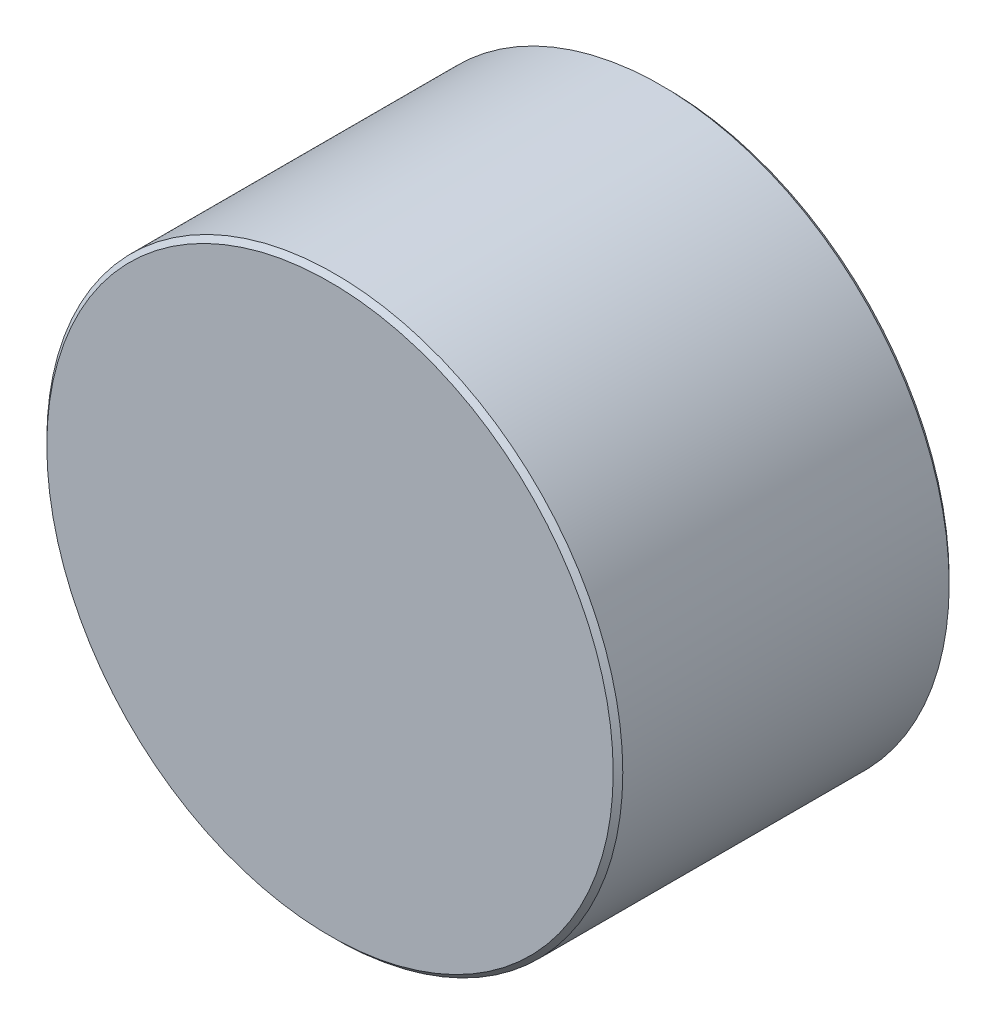
ISO-10303-21;
HEADER;
FILE_DESCRIPTION(('STEP AP214'),'2;1');
FILE_NAME('part.step','',(''),(''),'','','');
FILE_SCHEMA(('AUTOMOTIVE_DESIGN { 1 0 10303 214 1 1 1 1 }'));
ENDSEC;
DATA;
#1=APPLICATION_CONTEXT('core data for automotive mechanical design processes');
#2=APPLICATION_PROTOCOL_DEFINITION('international standard','automotive_design',2000,#1);
#3=PRODUCT_CONTEXT('',#1,'mechanical');
#4=PRODUCT('Part','Part','',(#3));
#5=PRODUCT_RELATED_PRODUCT_CATEGORY('part','',(#4));
#6=PRODUCT_DEFINITION_FORMATION('','',#4);
#7=PRODUCT_DEFINITION_CONTEXT('part definition',#1,'design');
#8=PRODUCT_DEFINITION('design','',#6,#7);
#9=PRODUCT_DEFINITION_SHAPE('','',#8);
#10=(LENGTH_UNIT() NAMED_UNIT(*) SI_UNIT(.MILLI.,.METRE.));
#11=(NAMED_UNIT(*) PLANE_ANGLE_UNIT() SI_UNIT($,.RADIAN.));
#12=(NAMED_UNIT(*) SI_UNIT($,.STERADIAN.) SOLID_ANGLE_UNIT());
#13=UNCERTAINTY_MEASURE_WITH_UNIT(LENGTH_MEASURE(1.E-05),#10,'distance_accuracy_value','');
#14=(GEOMETRIC_REPRESENTATION_CONTEXT(3) GLOBAL_UNCERTAINTY_ASSIGNED_CONTEXT((#13)) GLOBAL_UNIT_ASSIGNED_CONTEXT((#10,
#11,#12)) REPRESENTATION_CONTEXT('',''));
#15=CARTESIAN_POINT('',(0.,0.,0.));
#16=DIRECTION('',(0.,0.,1.));
#17=DIRECTION('',(1.,0.,0.));
#18=AXIS2_PLACEMENT_3D('',#15,#16,#17);
#19=CARTESIAN_POINT('',(0.,0.,7.));
#20=DIRECTION('',(0.,0.,-1.));
#21=DIRECTION('',(-1.,0.,0.));
#22=AXIS2_PLACEMENT_3D('',#19,#20,#21);
#23=CYLINDRICAL_SURFACE('',#22,5.99999999999995);
#24=CARTESIAN_POINT('',(0.,0.,0.0999999999999994));
#25=DIRECTION('',(0.,0.,1.));
#26=DIRECTION('',(1.,0.,0.));
#27=AXIS2_PLACEMENT_3D('',#24,#25,#26);
#28=CIRCLE('',#27,5.99999999999995);
#29=CARTESIAN_POINT('',(5.99999999999995,0.,0.0999999999999994));
#30=VERTEX_POINT('',#29);
#31=EDGE_CURVE('E53',#30,#30,#28,.T.);
#32=ORIENTED_EDGE('',*,*,#31,.T.);
#33=EDGE_LOOP('',(#32));
#34=FACE_BOUND('',#33,.T.);
#35=CARTESIAN_POINT('',(0.,0.,6.9));
#36=DIRECTION('',(0.,0.,1.));
#37=DIRECTION('',(1.,0.,0.));
#38=AXIS2_PLACEMENT_3D('',#35,#36,#37);
#39=CIRCLE('',#38,5.99999999999995);
#40=CARTESIAN_POINT('',(5.99999999999995,0.,6.9));
#41=VERTEX_POINT('',#40);
#42=EDGE_CURVE('E57',#41,#41,#39,.F.);
#43=ORIENTED_EDGE('',*,*,#42,.T.);
#44=EDGE_LOOP('',(#43));
#45=FACE_BOUND('',#44,.T.);
#46=ADVANCED_FACE('F41',(#34,#45),#23,.T.);
#47=CARTESIAN_POINT('',(0.,0.,7.));
#48=DIRECTION('',(0.,0.,1.));
#49=DIRECTION('',(1.,0.,0.));
#50=AXIS2_PLACEMENT_3D('',#47,#48,#49);
#51=PLANE('',#50);
#52=CARTESIAN_POINT('',(0.,0.,7.));
#53=DIRECTION('',(0.,0.,1.));
#54=DIRECTION('',(1.,0.,0.));
#55=AXIS2_PLACEMENT_3D('',#52,#53,#54);
#56=CIRCLE('',#55,5.89999999999995);
#57=CARTESIAN_POINT('',(5.89999999999995,0.,7.));
#58=VERTEX_POINT('',#57);
#59=EDGE_CURVE('E10',#58,#58,#56,.T.);
#60=ORIENTED_EDGE('',*,*,#59,.T.);
#61=EDGE_LOOP('',(#60));
#62=FACE_BOUND('',#61,.T.);
#63=ADVANCED_FACE('F73',(#62),#51,.T.);
#64=CARTESIAN_POINT('',(0.,0.,0.));
#65=DIRECTION('',(0.,0.,1.));
#66=DIRECTION('',(1.,0.,0.));
#67=AXIS2_PLACEMENT_3D('',#64,#65,#66);
#68=PLANE('',#67);
#69=CARTESIAN_POINT('',(0.,0.,0.));
#70=DIRECTION('',(0.,0.,1.));
#71=DIRECTION('',(1.,0.,0.));
#72=AXIS2_PLACEMENT_3D('',#69,#70,#71);
#73=CIRCLE('',#72,5.89999999999995);
#74=CARTESIAN_POINT('',(5.89999999999995,0.,0.));
#75=VERTEX_POINT('',#74);
#76=EDGE_CURVE('E49',#75,#75,#73,.F.);
#77=ORIENTED_EDGE('',*,*,#76,.T.);
#78=EDGE_LOOP('',(#77));
#79=FACE_BOUND('',#78,.T.);
#80=ADVANCED_FACE('F70',(#79),#68,.F.);
#81=CARTESIAN_POINT('',(0.,0.,0.0999999999999994));
#82=DIRECTION('',(0.,0.,1.));
#83=DIRECTION('',(1.,0.,0.));
#84=AXIS2_PLACEMENT_3D('',#81,#82,#83);
#85=CONICAL_SURFACE('',#84,5.99999999999995,0.785398163397453);
#86=ORIENTED_EDGE('',*,*,#76,.F.);
#87=EDGE_LOOP('',(#86));
#88=FACE_BOUND('',#87,.T.);
#89=ORIENTED_EDGE('',*,*,#31,.F.);
#90=EDGE_LOOP('',(#89));
#91=FACE_BOUND('',#90,.T.);
#92=ADVANCED_FACE('F66',(#88,#91),#85,.T.);
#93=CARTESIAN_POINT('',(0.,0.,7.));
#94=DIRECTION('',(0.,0.,-1.));
#95=DIRECTION('',(-1.,0.,0.));
#96=AXIS2_PLACEMENT_3D('',#93,#94,#95);
#97=CONICAL_SURFACE('',#96,5.89999999999995,0.785398163397448);
#98=ORIENTED_EDGE('',*,*,#42,.F.);
#99=EDGE_LOOP('',(#98));
#100=FACE_BOUND('',#99,.T.);
#101=ORIENTED_EDGE('',*,*,#59,.F.);
#102=EDGE_LOOP('',(#101));
#103=FACE_BOUND('',#102,.T.);
#104=ADVANCED_FACE('F44',(#100,#103),#97,.T.);
#105=CLOSED_SHELL('',(#46,#63,#80,#92,#104));
#106=MANIFOLD_SOLID_BREP('B2',#105);
#107=ADVANCED_BREP_SHAPE_REPRESENTATION('',(#18,#106),#14);
#108=SHAPE_DEFINITION_REPRESENTATION(#9,#107);
ENDSEC;
END-ISO-10303-21;
